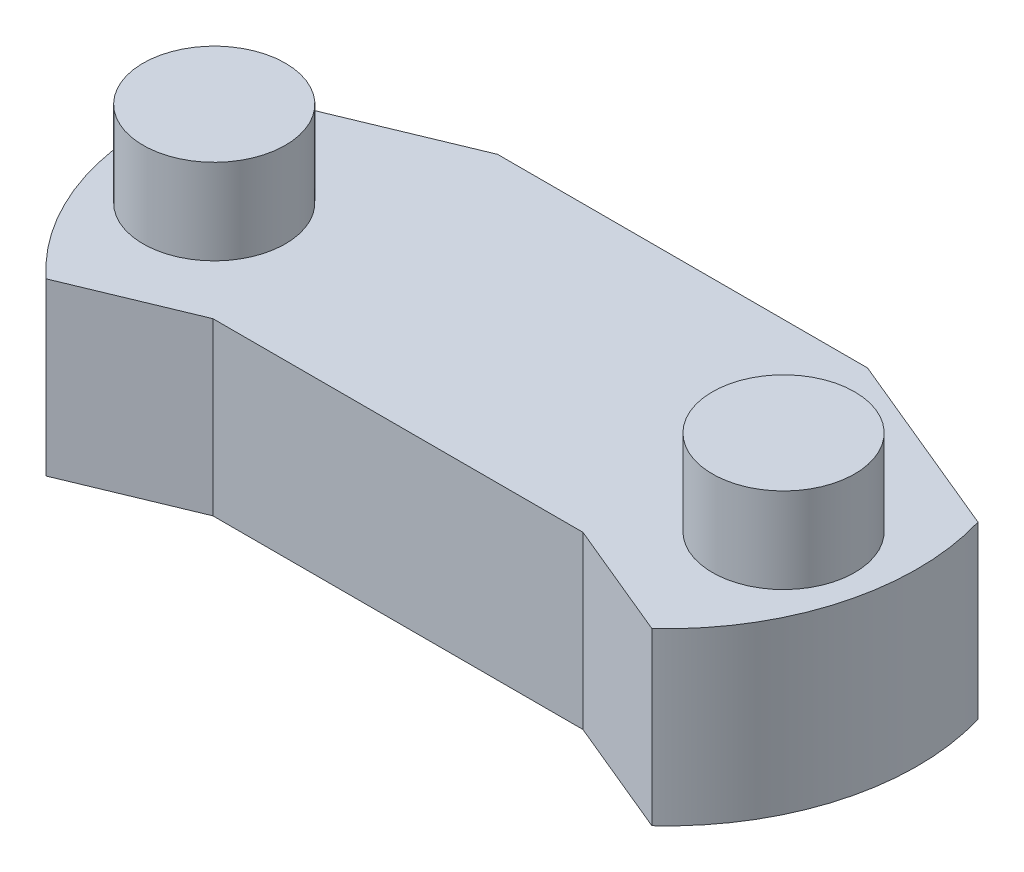
ISO-10303-21;
HEADER;
FILE_DESCRIPTION(('STEP AP214'),'2;1');
FILE_NAME('part.step','',(''),(''),'','','');
FILE_SCHEMA(('AUTOMOTIVE_DESIGN { 1 0 10303 214 1 1 1 1 }'));
ENDSEC;
DATA;
#1=APPLICATION_CONTEXT('core data for automotive mechanical design processes');
#2=APPLICATION_PROTOCOL_DEFINITION('international standard','automotive_design',2000,#1);
#3=PRODUCT_CONTEXT('',#1,'mechanical');
#4=PRODUCT('Part','Part','',(#3));
#5=PRODUCT_RELATED_PRODUCT_CATEGORY('part','',(#4));
#6=PRODUCT_DEFINITION_FORMATION('','',#4);
#7=PRODUCT_DEFINITION_CONTEXT('part definition',#1,'design');
#8=PRODUCT_DEFINITION('design','',#6,#7);
#9=PRODUCT_DEFINITION_SHAPE('','',#8);
#10=(LENGTH_UNIT() NAMED_UNIT(*) SI_UNIT(.MILLI.,.METRE.));
#11=(NAMED_UNIT(*) PLANE_ANGLE_UNIT() SI_UNIT($,.RADIAN.));
#12=(NAMED_UNIT(*) SI_UNIT($,.STERADIAN.) SOLID_ANGLE_UNIT());
#13=UNCERTAINTY_MEASURE_WITH_UNIT(LENGTH_MEASURE(1.E-05),#10,'distance_accuracy_value','');
#14=(GEOMETRIC_REPRESENTATION_CONTEXT(3) GLOBAL_UNCERTAINTY_ASSIGNED_CONTEXT((#13)) GLOBAL_UNIT_ASSIGNED_CONTEXT((#10,
#11,#12)) REPRESENTATION_CONTEXT('',''));
#15=CARTESIAN_POINT('',(0.,0.,0.));
#16=DIRECTION('',(0.,0.,1.));
#17=DIRECTION('',(1.,0.,0.));
#18=AXIS2_PLACEMENT_3D('',#15,#16,#17);
#19=CARTESIAN_POINT('',(1.67686501105315,30.,4.04279490956449));
#20=DIRECTION('',(0.383128915159058,0.,0.923694881640601));
#21=DIRECTION('',(0.923694881640601,0.,-0.383128915159058));
#22=AXIS2_PLACEMENT_3D('',#19,#20,#21);
#23=PLANE('',#22);
#24=DIRECTION('',(-0.923694881640601,0.,0.383128915159058));
#25=VECTOR('',#24,1.);
#26=CARTESIAN_POINT('',(1.67686501105315,30.,4.04279490956449));
#27=LINE('',#26,#25);
#28=CARTESIAN_POINT('',(-21.4869685192061,30.,13.6506584885101));
#29=VERTEX_POINT('',#28);
#30=CARTESIAN_POINT('',(-42.1841053295727,30.,22.2353889343152));
#31=VERTEX_POINT('',#30);
#32=EDGE_CURVE('E126',#29,#31,#27,.T.);
#33=ORIENTED_EDGE('',*,*,#32,.T.);
#34=DIRECTION('',(0.,1.,0.));
#35=VECTOR('',#34,1.);
#36=CARTESIAN_POINT('',(-42.1841053295727,0.,22.2353889343152));
#37=LINE('',#36,#35);
#38=CARTESIAN_POINT('',(-42.1841053295727,0.,22.2353889343152));
#39=VERTEX_POINT('',#38);
#40=EDGE_CURVE('E122',#39,#31,#37,.T.);
#41=ORIENTED_EDGE('',*,*,#40,.F.);
#42=DIRECTION('',(-0.923694881640601,0.,0.383128915159058));
#43=VECTOR('',#42,1.);
#44=CARTESIAN_POINT('',(1.67686501105315,0.,4.04279490956449));
#45=LINE('',#44,#43);
#46=CARTESIAN_POINT('',(-21.4869685192061,0.,13.6506584885101));
#47=VERTEX_POINT('',#46);
#48=EDGE_CURVE('E121',#47,#39,#45,.T.);
#49=ORIENTED_EDGE('',*,*,#48,.F.);
#50=DIRECTION('',(0.,-1.,0.));
#51=VECTOR('',#50,1.);
#52=CARTESIAN_POINT('',(-21.4869685192061,30.,13.6506584885101));
#53=LINE('',#52,#51);
#54=EDGE_CURVE('E111',#29,#47,#53,.T.);
#55=ORIENTED_EDGE('',*,*,#54,.F.);
#56=EDGE_LOOP('',(#33,#41,#49,#55));
#57=FACE_BOUND('',#56,.T.);
#58=ADVANCED_FACE('F43',(#57),#23,.T.);
#59=CARTESIAN_POINT('',(0.,30.,0.));
#60=DIRECTION('',(0.,1.,0.));
#61=DIRECTION('',(0.,0.,1.));
#62=AXIS2_PLACEMENT_3D('',#59,#60,#61);
#63=PLANE('',#62);
#64=CARTESIAN_POINT('',(-38.9869685192061,30.,-4.09071515277821));
#65=DIRECTION('',(0.,1.,0.));
#66=DIRECTION('',(0.,0.,1.));
#67=AXIS2_PLACEMENT_3D('',#64,#65,#66);
#68=CIRCLE('',#67,12.5);
#69=CARTESIAN_POINT('',(-38.9869685192061,30.,-16.5907151527782));
#70=VERTEX_POINT('',#69);
#71=EDGE_CURVE('E138',#70,#70,#68,.T.);
#72=ORIENTED_EDGE('',*,*,#71,.F.);
#73=EDGE_LOOP('',(#72));
#74=FACE_BOUND('',#73,.T.);
#75=CARTESIAN_POINT('',(61.0130314807939,30.,-4.09071515277821));
#76=DIRECTION('',(0.,1.,0.));
#77=DIRECTION('',(0.,0.,1.));
#78=AXIS2_PLACEMENT_3D('',#75,#76,#77);
#79=CIRCLE('',#78,12.5);
#80=CARTESIAN_POINT('',(61.0130314807939,30.,-16.5907151527782));
#81=VERTEX_POINT('',#80);
#82=EDGE_CURVE('E158',#81,#81,#79,.T.);
#83=ORIENTED_EDGE('',*,*,#82,.F.);
#84=EDGE_LOOP('',(#83));
#85=FACE_BOUND('',#84,.T.);
#86=DIRECTION('',(-0.923694881640601,0.,0.383128915159058));
#87=VECTOR('',#86,1.);
#88=CARTESIAN_POINT('',(-16.0178458859937,30.,-38.6178168088877));
#89=LINE('',#88,#87);
#90=CARTESIAN_POINT('',(-21.4869685192061,30.,-36.3493415114899));
#91=VERTEX_POINT('',#90);
#92=CARTESIAN_POINT('',(-54.6363552646833,30.,-22.5996836597272));
#93=VERTEX_POINT('',#92);
#94=EDGE_CURVE('E195',#91,#93,#89,.T.);
#95=ORIENTED_EDGE('',*,*,#94,.T.);
#96=CARTESIAN_POINT('',(-12.5032572490021,30.,-10.1547553443413));
#97=DIRECTION('',(0.,1.,0.));
#98=DIRECTION('',(0.,0.,1.));
#99=AXIS2_PLACEMENT_3D('',#96,#97,#98);
#100=CIRCLE('',#99,43.9326096330971);
#101=EDGE_CURVE('E57',#93,#31,#100,.T.);
#102=ORIENTED_EDGE('',*,*,#101,.T.);
#103=ORIENTED_EDGE('',*,*,#32,.F.);
#104=DIRECTION('',(1.,0.,0.));
#105=VECTOR('',#104,1.);
#106=CARTESIAN_POINT('',(0.,30.,13.6506584885101));
#107=LINE('',#106,#105);
#108=CARTESIAN_POINT('',(43.5130314807939,30.,13.6506584885101));
#109=VERTEX_POINT('',#108);
#110=EDGE_CURVE('E130',#29,#109,#107,.T.);
#111=ORIENTED_EDGE('',*,*,#110,.T.);
#112=DIRECTION('',(0.923694881640601,0.,0.383128915159058));
#113=VECTOR('',#112,1.);
#114=CARTESIAN_POINT('',(1.55629155672509,30.,-3.75210141654448));
#115=LINE('',#114,#113);
#116=CARTESIAN_POINT('',(64.2101682911605,30.,22.2353889343152));
#117=VERTEX_POINT('',#116);
#118=EDGE_CURVE('E179',#109,#117,#115,.T.);
#119=ORIENTED_EDGE('',*,*,#118,.T.);
#120=CARTESIAN_POINT('',(34.5293202105899,30.,-10.1547553443413));
#121=DIRECTION('',(0.,1.,0.));
#122=DIRECTION('',(0.,0.,1.));
#123=AXIS2_PLACEMENT_3D('',#120,#121,#122);
#124=CIRCLE('',#123,43.9326096330971);
#125=CARTESIAN_POINT('',(76.6624182262711,30.,-22.5996836597271));
#126=VERTEX_POINT('',#125);
#127=EDGE_CURVE('E172',#126,#117,#124,.F.);
#128=ORIENTED_EDGE('',*,*,#127,.F.);
#129=DIRECTION('',(0.923694881640601,0.,0.383128915159058));
#130=VECTOR('',#129,1.);
#131=CARTESIAN_POINT('',(19.251002453772,30.,-46.4127131349967));
#132=LINE('',#131,#130);
#133=CARTESIAN_POINT('',(43.5130314807939,30.,-36.3493415114899));
#134=VERTEX_POINT('',#133);
#135=EDGE_CURVE('E169',#134,#126,#132,.T.);
#136=ORIENTED_EDGE('',*,*,#135,.F.);
#137=DIRECTION('',(1.,0.,0.));
#138=VECTOR('',#137,1.);
#139=CARTESIAN_POINT('',(0.,30.,-36.3493415114899));
#140=LINE('',#139,#138);
#141=EDGE_CURVE('E194',#91,#134,#140,.T.);
#142=ORIENTED_EDGE('',*,*,#141,.F.);
#143=EDGE_LOOP('',(#95,#102,#103,#111,#119,#128,#136,#142));
#144=FACE_BOUND('',#143,.T.);
#145=ADVANCED_FACE('F176',(#74,#85,#144),#63,.T.);
#146=CARTESIAN_POINT('',(0.,0.,0.));
#147=DIRECTION('',(0.,1.,0.));
#148=DIRECTION('',(0.,0.,1.));
#149=AXIS2_PLACEMENT_3D('',#146,#147,#148);
#150=PLANE('',#149);
#151=CARTESIAN_POINT('',(-12.5032572490021,0.,-10.1547553443413));
#152=DIRECTION('',(0.,1.,0.));
#153=DIRECTION('',(0.,0.,1.));
#154=AXIS2_PLACEMENT_3D('',#151,#152,#153);
#155=CIRCLE('',#154,43.9326096330971);
#156=CARTESIAN_POINT('',(-54.6363552646833,0.,-22.5996836597272));
#157=VERTEX_POINT('',#156);
#158=EDGE_CURVE('E105',#157,#39,#155,.T.);
#159=ORIENTED_EDGE('',*,*,#158,.F.);
#160=DIRECTION('',(-0.923694881640601,0.,0.383128915159058));
#161=VECTOR('',#160,1.);
#162=CARTESIAN_POINT('',(-16.0178458859937,0.,-38.6178168088877));
#163=LINE('',#162,#161);
#164=CARTESIAN_POINT('',(-21.4869685192061,0.,-36.3493415114899));
#165=VERTEX_POINT('',#164);
#166=EDGE_CURVE('E117',#165,#157,#163,.T.);
#167=ORIENTED_EDGE('',*,*,#166,.F.);
#168=DIRECTION('',(1.,0.,0.));
#169=VECTOR('',#168,1.);
#170=CARTESIAN_POINT('',(0.,0.,-36.3493415114899));
#171=LINE('',#170,#169);
#172=CARTESIAN_POINT('',(43.5130314807939,0.,-36.3493415114899));
#173=VERTEX_POINT('',#172);
#174=EDGE_CURVE('E127',#165,#173,#171,.T.);
#175=ORIENTED_EDGE('',*,*,#174,.T.);
#176=DIRECTION('',(0.923694881640601,0.,0.383128915159058));
#177=VECTOR('',#176,1.);
#178=CARTESIAN_POINT('',(19.251002453772,0.,-46.4127131349967));
#179=LINE('',#178,#177);
#180=CARTESIAN_POINT('',(76.6624182262711,0.,-22.5996836597271));
#181=VERTEX_POINT('',#180);
#182=EDGE_CURVE('E132',#173,#181,#179,.T.);
#183=ORIENTED_EDGE('',*,*,#182,.T.);
#184=CARTESIAN_POINT('',(34.5293202105899,0.,-10.1547553443413));
#185=DIRECTION('',(0.,1.,0.));
#186=DIRECTION('',(0.,0.,1.));
#187=AXIS2_PLACEMENT_3D('',#184,#185,#186);
#188=CIRCLE('',#187,43.9326096330971);
#189=CARTESIAN_POINT('',(64.2101682911605,0.,22.2353889343152));
#190=VERTEX_POINT('',#189);
#191=EDGE_CURVE('E65',#181,#190,#188,.F.);
#192=ORIENTED_EDGE('',*,*,#191,.T.);
#193=DIRECTION('',(0.923694881640601,0.,0.383128915159058));
#194=VECTOR('',#193,1.);
#195=CARTESIAN_POINT('',(1.55629155672509,0.,-3.75210141654448));
#196=LINE('',#195,#194);
#197=CARTESIAN_POINT('',(43.5130314807939,0.,13.6506584885101));
#198=VERTEX_POINT('',#197);
#199=EDGE_CURVE('E153',#198,#190,#196,.T.);
#200=ORIENTED_EDGE('',*,*,#199,.F.);
#201=DIRECTION('',(1.,0.,0.));
#202=VECTOR('',#201,1.);
#203=CARTESIAN_POINT('',(0.,0.,13.6506584885101));
#204=LINE('',#203,#202);
#205=EDGE_CURVE('E148',#47,#198,#204,.T.);
#206=ORIENTED_EDGE('',*,*,#205,.F.);
#207=ORIENTED_EDGE('',*,*,#48,.T.);
#208=EDGE_LOOP('',(#159,#167,#175,#183,#192,#200,#206,#207));
#209=FACE_BOUND('',#208,.T.);
#210=ADVANCED_FACE('F115',(#209),#150,.F.);
#211=CARTESIAN_POINT('',(0.,30.,13.6506584885101));
#212=DIRECTION('',(0.,0.,-1.));
#213=DIRECTION('',(-1.,0.,0.));
#214=AXIS2_PLACEMENT_3D('',#211,#212,#213);
#215=PLANE('',#214);
#216=ORIENTED_EDGE('',*,*,#205,.T.);
#217=DIRECTION('',(0.,-1.,0.));
#218=VECTOR('',#217,1.);
#219=CARTESIAN_POINT('',(43.5130314807939,30.,13.6506584885101));
#220=LINE('',#219,#218);
#221=EDGE_CURVE('E140',#109,#198,#220,.T.);
#222=ORIENTED_EDGE('',*,*,#221,.F.);
#223=ORIENTED_EDGE('',*,*,#110,.F.);
#224=ORIENTED_EDGE('',*,*,#54,.T.);
#225=EDGE_LOOP('',(#216,#222,#223,#224));
#226=FACE_BOUND('',#225,.T.);
#227=ADVANCED_FACE('F146',(#226),#215,.F.);
#228=CARTESIAN_POINT('',(1.55629155672509,30.,-3.75210141654448));
#229=DIRECTION('',(0.383128915159058,0.,-0.923694881640601));
#230=DIRECTION('',(-0.923694881640601,0.,-0.383128915159058));
#231=AXIS2_PLACEMENT_3D('',#228,#229,#230);
#232=PLANE('',#231);
#233=ORIENTED_EDGE('',*,*,#199,.T.);
#234=DIRECTION('',(0.,1.,0.));
#235=VECTOR('',#234,1.);
#236=CARTESIAN_POINT('',(64.2101682911605,0.,22.2353889343152));
#237=LINE('',#236,#235);
#238=EDGE_CURVE('E181',#190,#117,#237,.T.);
#239=ORIENTED_EDGE('',*,*,#238,.T.);
#240=ORIENTED_EDGE('',*,*,#118,.F.);
#241=ORIENTED_EDGE('',*,*,#221,.T.);
#242=EDGE_LOOP('',(#233,#239,#240,#241));
#243=FACE_BOUND('',#242,.T.);
#244=ADVANCED_FACE('F241',(#243),#232,.F.);
#245=CARTESIAN_POINT('',(19.251002453772,30.,-46.4127131349967));
#246=DIRECTION('',(0.383128915159058,0.,-0.923694881640601));
#247=DIRECTION('',(-0.923694881640601,0.,-0.383128915159058));
#248=AXIS2_PLACEMENT_3D('',#245,#246,#247);
#249=PLANE('',#248);
#250=ORIENTED_EDGE('',*,*,#135,.T.);
#251=DIRECTION('',(0.,-1.,0.));
#252=VECTOR('',#251,1.);
#253=CARTESIAN_POINT('',(76.6624182262711,30.,-22.5996836597271));
#254=LINE('',#253,#252);
#255=EDGE_CURVE('E11',#126,#181,#254,.T.);
#256=ORIENTED_EDGE('',*,*,#255,.T.);
#257=ORIENTED_EDGE('',*,*,#182,.F.);
#258=DIRECTION('',(0.,-1.,0.));
#259=VECTOR('',#258,1.);
#260=CARTESIAN_POINT('',(43.5130314807939,30.,-36.3493415114899));
#261=LINE('',#260,#259);
#262=EDGE_CURVE('E137',#134,#173,#261,.T.);
#263=ORIENTED_EDGE('',*,*,#262,.F.);
#264=EDGE_LOOP('',(#250,#256,#257,#263));
#265=FACE_BOUND('',#264,.T.);
#266=ADVANCED_FACE('F167',(#265),#249,.T.);
#267=CARTESIAN_POINT('',(0.,30.,-36.3493415114899));
#268=DIRECTION('',(0.,0.,-1.));
#269=DIRECTION('',(-1.,0.,0.));
#270=AXIS2_PLACEMENT_3D('',#267,#268,#269);
#271=PLANE('',#270);
#272=ORIENTED_EDGE('',*,*,#174,.F.);
#273=DIRECTION('',(0.,-1.,0.));
#274=VECTOR('',#273,1.);
#275=CARTESIAN_POINT('',(-21.4869685192061,30.,-36.3493415114899));
#276=LINE('',#275,#274);
#277=EDGE_CURVE('E125',#91,#165,#276,.T.);
#278=ORIENTED_EDGE('',*,*,#277,.F.);
#279=ORIENTED_EDGE('',*,*,#141,.T.);
#280=ORIENTED_EDGE('',*,*,#262,.T.);
#281=EDGE_LOOP('',(#272,#278,#279,#280));
#282=FACE_BOUND('',#281,.T.);
#283=ADVANCED_FACE('F254',(#282),#271,.T.);
#284=CARTESIAN_POINT('',(-16.0178458859937,30.,-38.6178168088877));
#285=DIRECTION('',(0.383128915159058,0.,0.923694881640601));
#286=DIRECTION('',(0.923694881640601,0.,-0.383128915159058));
#287=AXIS2_PLACEMENT_3D('',#284,#285,#286);
#288=PLANE('',#287);
#289=ORIENTED_EDGE('',*,*,#166,.T.);
#290=DIRECTION('',(0.,-1.,0.));
#291=VECTOR('',#290,1.);
#292=CARTESIAN_POINT('',(-54.6363552646833,30.,-22.5996836597272));
#293=LINE('',#292,#291);
#294=EDGE_CURVE('E50',#157,#93,#293,.F.);
#295=ORIENTED_EDGE('',*,*,#294,.T.);
#296=ORIENTED_EDGE('',*,*,#94,.F.);
#297=ORIENTED_EDGE('',*,*,#277,.T.);
#298=EDGE_LOOP('',(#289,#295,#296,#297));
#299=FACE_BOUND('',#298,.T.);
#300=ADVANCED_FACE('F124',(#299),#288,.F.);
#301=CARTESIAN_POINT('',(-38.9869685192061,45.,-4.09071515277821));
#302=DIRECTION('',(0.,-1.,0.));
#303=DIRECTION('',(0.,0.,-1.));
#304=AXIS2_PLACEMENT_3D('',#301,#302,#303);
#305=CYLINDRICAL_SURFACE('',#304,12.5);
#306=CARTESIAN_POINT('',(-38.9869685192061,45.,-4.09071515277821));
#307=DIRECTION('',(0.,-1.,0.));
#308=DIRECTION('',(0.,0.,-1.));
#309=AXIS2_PLACEMENT_3D('',#306,#307,#308);
#310=CIRCLE('',#309,12.5);
#311=CARTESIAN_POINT('',(-38.9869685192061,45.,-16.5907151527782));
#312=VERTEX_POINT('',#311);
#313=EDGE_CURVE('E155',#312,#312,#310,.T.);
#314=CARTESIAN_POINT('',(-38.9869685192061,30.,-16.5907151527782));
#315=CARTESIAN_POINT('',(-38.9869685192061,30.15625,-16.5907151527782));
#316=CARTESIAN_POINT('',(-38.9869685192061,30.3125,-16.5907151527782));
#317=CARTESIAN_POINT('',(-38.9869685192061,30.625,-16.5907151527782));
#318=CARTESIAN_POINT('',(-38.9869685192061,30.78125,-16.5907151527782));
#319=CARTESIAN_POINT('',(-38.9869685192061,31.09375,-16.5907151527782));
#320=CARTESIAN_POINT('',(-38.9869685192061,31.25,-16.5907151527782));
#321=CARTESIAN_POINT('',(-38.9869685192061,31.5625,-16.5907151527782));
#322=CARTESIAN_POINT('',(-38.9869685192061,31.71875,-16.5907151527782));
#323=CARTESIAN_POINT('',(-38.9869685192061,32.03125,-16.5907151527782));
#324=CARTESIAN_POINT('',(-38.9869685192061,32.1875,-16.5907151527782));
#325=CARTESIAN_POINT('',(-38.9869685192061,32.5,-16.5907151527782));
#326=CARTESIAN_POINT('',(-38.9869685192061,32.65625,-16.5907151527782));
#327=CARTESIAN_POINT('',(-38.9869685192061,32.96875,-16.5907151527782));
#328=CARTESIAN_POINT('',(-38.9869685192061,33.125,-16.5907151527782));
#329=CARTESIAN_POINT('',(-38.9869685192061,33.4375,-16.5907151527782));
#330=CARTESIAN_POINT('',(-38.9869685192061,33.59375,-16.5907151527782));
#331=CARTESIAN_POINT('',(-38.9869685192061,33.90625,-16.5907151527782));
#332=CARTESIAN_POINT('',(-38.9869685192061,34.0625,-16.5907151527782));
#333=CARTESIAN_POINT('',(-38.9869685192061,34.375,-16.5907151527782));
#334=CARTESIAN_POINT('',(-38.9869685192061,34.53125,-16.5907151527782));
#335=CARTESIAN_POINT('',(-38.9869685192061,34.84375,-16.5907151527782));
#336=CARTESIAN_POINT('',(-38.9869685192061,35.,-16.5907151527782));
#337=CARTESIAN_POINT('',(-38.9869685192061,35.3125,-16.5907151527782));
#338=CARTESIAN_POINT('',(-38.9869685192061,35.46875,-16.5907151527782));
#339=CARTESIAN_POINT('',(-38.9869685192061,35.78125,-16.5907151527782));
#340=CARTESIAN_POINT('',(-38.9869685192061,35.9375,-16.5907151527782));
#341=CARTESIAN_POINT('',(-38.9869685192061,36.25,-16.5907151527782));
#342=CARTESIAN_POINT('',(-38.9869685192061,36.40625,-16.5907151527782));
#343=CARTESIAN_POINT('',(-38.9869685192061,36.71875,-16.5907151527782));
#344=CARTESIAN_POINT('',(-38.9869685192061,36.875,-16.5907151527782));
#345=CARTESIAN_POINT('',(-38.9869685192061,37.1875,-16.5907151527782));
#346=CARTESIAN_POINT('',(-38.9869685192061,37.34375,-16.5907151527782));
#347=CARTESIAN_POINT('',(-38.9869685192061,37.65625,-16.5907151527782));
#348=CARTESIAN_POINT('',(-38.9869685192061,37.8125,-16.5907151527782));
#349=CARTESIAN_POINT('',(-38.9869685192061,38.125,-16.5907151527782));
#350=CARTESIAN_POINT('',(-38.9869685192061,38.28125,-16.5907151527782));
#351=CARTESIAN_POINT('',(-38.9869685192061,38.59375,-16.5907151527782));
#352=CARTESIAN_POINT('',(-38.9869685192061,38.75,-16.5907151527782));
#353=CARTESIAN_POINT('',(-38.9869685192061,39.0625,-16.5907151527782));
#354=CARTESIAN_POINT('',(-38.9869685192061,39.21875,-16.5907151527782));
#355=CARTESIAN_POINT('',(-38.9869685192061,39.53125,-16.5907151527782));
#356=CARTESIAN_POINT('',(-38.9869685192061,39.6875,-16.5907151527782));
#357=CARTESIAN_POINT('',(-38.9869685192061,40.,-16.5907151527782));
#358=CARTESIAN_POINT('',(-38.9869685192061,40.15625,-16.5907151527782));
#359=CARTESIAN_POINT('',(-38.9869685192061,40.46875,-16.5907151527782));
#360=CARTESIAN_POINT('',(-38.9869685192061,40.625,-16.5907151527782));
#361=CARTESIAN_POINT('',(-38.9869685192061,40.9375,-16.5907151527782));
#362=CARTESIAN_POINT('',(-38.9869685192061,41.09375,-16.5907151527782));
#363=CARTESIAN_POINT('',(-38.9869685192061,41.40625,-16.5907151527782));
#364=CARTESIAN_POINT('',(-38.9869685192061,41.5625,-16.5907151527782));
#365=CARTESIAN_POINT('',(-38.9869685192061,41.875,-16.5907151527782));
#366=CARTESIAN_POINT('',(-38.9869685192061,42.03125,-16.5907151527782));
#367=CARTESIAN_POINT('',(-38.9869685192061,42.34375,-16.5907151527782));
#368=CARTESIAN_POINT('',(-38.9869685192061,42.5,-16.5907151527782));
#369=CARTESIAN_POINT('',(-38.9869685192061,42.8125,-16.5907151527782));
#370=CARTESIAN_POINT('',(-38.9869685192061,42.96875,-16.5907151527782));
#371=CARTESIAN_POINT('',(-38.9869685192061,43.28125,-16.5907151527782));
#372=CARTESIAN_POINT('',(-38.9869685192061,43.4375,-16.5907151527782));
#373=CARTESIAN_POINT('',(-38.9869685192061,43.75,-16.5907151527782));
#374=CARTESIAN_POINT('',(-38.9869685192061,43.90625,-16.5907151527782));
#375=CARTESIAN_POINT('',(-38.9869685192061,44.21875,-16.5907151527782));
#376=CARTESIAN_POINT('',(-38.9869685192061,44.375,-16.5907151527782));
#377=CARTESIAN_POINT('',(-38.9869685192061,44.6875,-16.5907151527782));
#378=CARTESIAN_POINT('',(-38.9869685192061,44.84375,-16.5907151527782));
#379=CARTESIAN_POINT('',(-38.9869685192061,45.,-16.5907151527782));
#380=B_SPLINE_CURVE_WITH_KNOTS('',3,(#314,#315,#316,#317,#318,#319,#320,#321,#322,#323,#324,
#325,#326,#327,#328,#329,#330,#331,#332,#333,#334,#335,#336,#337,#338,#339,#340,#341,#342,#343,
#344,#345,#346,#347,#348,#349,#350,#351,#352,#353,#354,#355,#356,#357,#358,#359,#360,#361,#362,
#363,#364,#365,#366,#367,#368,#369,#370,#371,#372,#373,#374,#375,#376,#377,#378,#379),
.UNSPECIFIED.,.F.,.F.,(4,2,2,2,2,2,2,2,2,2,2,2,2,2,2,2,2,2,2,2,2,2,2,2,2,2,2,2,2,2,2,2,4),(0.,
0.468749999999997,0.937500000000001,1.40625,1.875,2.34375,2.8125,3.28125,3.75,4.21875,4.6875,
5.15625,5.625,6.09375,6.5625,7.03125,7.5,7.96875,8.4375,8.90625,9.375,9.84375,10.3125,10.78125,
11.25,11.71875,12.1875,12.65625,13.125,13.59375,14.0625,14.53125,15.),.UNSPECIFIED.);
#381=EDGE_CURVE('BSEAM199',#70,#312,#380,.T.);
#382=ORIENTED_EDGE('',*,*,#71,.T.);
#383=ORIENTED_EDGE('',*,*,#313,.T.);
#384=ORIENTED_EDGE('',*,*,#381,.T.);
#385=ORIENTED_EDGE('',*,*,#381,.F.);
#386=EDGE_LOOP('',(#382,#384,#383,#385));
#387=FACE_BOUND('',#386,.T.);
#388=ADVANCED_FACE('F199',(#387),#305,.T.);
#389=CARTESIAN_POINT('',(-38.9869685192061,45.,-4.09071515277821));
#390=DIRECTION('',(0.,-1.,0.));
#391=DIRECTION('',(0.,0.,-1.));
#392=AXIS2_PLACEMENT_3D('',#389,#390,#391);
#393=PLANE('',#392);
#394=ORIENTED_EDGE('',*,*,#313,.F.);
#395=EDGE_LOOP('',(#394));
#396=FACE_BOUND('',#395,.T.);
#397=ADVANCED_FACE('F211',(#396),#393,.F.);
#398=CARTESIAN_POINT('',(61.0130314807939,45.,-4.09071515277821));
#399=DIRECTION('',(0.,-1.,0.));
#400=DIRECTION('',(0.,0.,-1.));
#401=AXIS2_PLACEMENT_3D('',#398,#399,#400);
#402=CYLINDRICAL_SURFACE('',#401,12.5);
#403=CARTESIAN_POINT('',(61.0130314807939,45.,-4.09071515277821));
#404=DIRECTION('',(0.,-1.,0.));
#405=DIRECTION('',(0.,0.,-1.));
#406=AXIS2_PLACEMENT_3D('',#403,#404,#405);
#407=CIRCLE('',#406,12.5);
#408=CARTESIAN_POINT('',(61.0130314807939,45.,-16.5907151527782));
#409=VERTEX_POINT('',#408);
#410=EDGE_CURVE('E186',#409,#409,#407,.T.);
#411=CARTESIAN_POINT('',(61.0130314807939,30.,-16.5907151527782));
#412=CARTESIAN_POINT('',(61.0130314807939,30.15625,-16.5907151527782));
#413=CARTESIAN_POINT('',(61.0130314807939,30.3125,-16.5907151527782));
#414=CARTESIAN_POINT('',(61.0130314807939,30.625,-16.5907151527782));
#415=CARTESIAN_POINT('',(61.0130314807939,30.78125,-16.5907151527782));
#416=CARTESIAN_POINT('',(61.0130314807939,31.09375,-16.5907151527782));
#417=CARTESIAN_POINT('',(61.0130314807939,31.25,-16.5907151527782));
#418=CARTESIAN_POINT('',(61.0130314807939,31.5625,-16.5907151527782));
#419=CARTESIAN_POINT('',(61.0130314807939,31.71875,-16.5907151527782));
#420=CARTESIAN_POINT('',(61.0130314807939,32.03125,-16.5907151527782));
#421=CARTESIAN_POINT('',(61.0130314807939,32.1875,-16.5907151527782));
#422=CARTESIAN_POINT('',(61.0130314807939,32.5,-16.5907151527782));
#423=CARTESIAN_POINT('',(61.0130314807939,32.65625,-16.5907151527782));
#424=CARTESIAN_POINT('',(61.0130314807939,32.96875,-16.5907151527782));
#425=CARTESIAN_POINT('',(61.0130314807939,33.125,-16.5907151527782));
#426=CARTESIAN_POINT('',(61.0130314807939,33.4375,-16.5907151527782));
#427=CARTESIAN_POINT('',(61.0130314807939,33.59375,-16.5907151527782));
#428=CARTESIAN_POINT('',(61.0130314807939,33.90625,-16.5907151527782));
#429=CARTESIAN_POINT('',(61.0130314807939,34.0625,-16.5907151527782));
#430=CARTESIAN_POINT('',(61.0130314807939,34.375,-16.5907151527782));
#431=CARTESIAN_POINT('',(61.0130314807939,34.53125,-16.5907151527782));
#432=CARTESIAN_POINT('',(61.0130314807939,34.84375,-16.5907151527782));
#433=CARTESIAN_POINT('',(61.0130314807939,35.,-16.5907151527782));
#434=CARTESIAN_POINT('',(61.0130314807939,35.3125,-16.5907151527782));
#435=CARTESIAN_POINT('',(61.0130314807939,35.46875,-16.5907151527782));
#436=CARTESIAN_POINT('',(61.0130314807939,35.78125,-16.5907151527782));
#437=CARTESIAN_POINT('',(61.0130314807939,35.9375,-16.5907151527782));
#438=CARTESIAN_POINT('',(61.0130314807939,36.25,-16.5907151527782));
#439=CARTESIAN_POINT('',(61.0130314807939,36.40625,-16.5907151527782));
#440=CARTESIAN_POINT('',(61.0130314807939,36.71875,-16.5907151527782));
#441=CARTESIAN_POINT('',(61.0130314807939,36.875,-16.5907151527782));
#442=CARTESIAN_POINT('',(61.0130314807939,37.1875,-16.5907151527782));
#443=CARTESIAN_POINT('',(61.0130314807939,37.34375,-16.5907151527782));
#444=CARTESIAN_POINT('',(61.0130314807939,37.65625,-16.5907151527782));
#445=CARTESIAN_POINT('',(61.0130314807939,37.8125,-16.5907151527782));
#446=CARTESIAN_POINT('',(61.0130314807939,38.125,-16.5907151527782));
#447=CARTESIAN_POINT('',(61.0130314807939,38.28125,-16.5907151527782));
#448=CARTESIAN_POINT('',(61.0130314807939,38.59375,-16.5907151527782));
#449=CARTESIAN_POINT('',(61.0130314807939,38.75,-16.5907151527782));
#450=CARTESIAN_POINT('',(61.0130314807939,39.0625,-16.5907151527782));
#451=CARTESIAN_POINT('',(61.0130314807939,39.21875,-16.5907151527782));
#452=CARTESIAN_POINT('',(61.0130314807939,39.53125,-16.5907151527782));
#453=CARTESIAN_POINT('',(61.0130314807939,39.6875,-16.5907151527782));
#454=CARTESIAN_POINT('',(61.0130314807939,40.,-16.5907151527782));
#455=CARTESIAN_POINT('',(61.0130314807939,40.15625,-16.5907151527782));
#456=CARTESIAN_POINT('',(61.0130314807939,40.46875,-16.5907151527782));
#457=CARTESIAN_POINT('',(61.0130314807939,40.625,-16.5907151527782));
#458=CARTESIAN_POINT('',(61.0130314807939,40.9375,-16.5907151527782));
#459=CARTESIAN_POINT('',(61.0130314807939,41.09375,-16.5907151527782));
#460=CARTESIAN_POINT('',(61.0130314807939,41.40625,-16.5907151527782));
#461=CARTESIAN_POINT('',(61.0130314807939,41.5625,-16.5907151527782));
#462=CARTESIAN_POINT('',(61.0130314807939,41.875,-16.5907151527782));
#463=CARTESIAN_POINT('',(61.0130314807939,42.03125,-16.5907151527782));
#464=CARTESIAN_POINT('',(61.0130314807939,42.34375,-16.5907151527782));
#465=CARTESIAN_POINT('',(61.0130314807939,42.5,-16.5907151527782));
#466=CARTESIAN_POINT('',(61.0130314807939,42.8125,-16.5907151527782));
#467=CARTESIAN_POINT('',(61.0130314807939,42.96875,-16.5907151527782));
#468=CARTESIAN_POINT('',(61.0130314807939,43.28125,-16.5907151527782));
#469=CARTESIAN_POINT('',(61.0130314807939,43.4375,-16.5907151527782));
#470=CARTESIAN_POINT('',(61.0130314807939,43.75,-16.5907151527782));
#471=CARTESIAN_POINT('',(61.0130314807939,43.90625,-16.5907151527782));
#472=CARTESIAN_POINT('',(61.0130314807939,44.21875,-16.5907151527782));
#473=CARTESIAN_POINT('',(61.0130314807939,44.375,-16.5907151527782));
#474=CARTESIAN_POINT('',(61.0130314807939,44.6875,-16.5907151527782));
#475=CARTESIAN_POINT('',(61.0130314807939,44.84375,-16.5907151527782));
#476=CARTESIAN_POINT('',(61.0130314807939,45.,-16.5907151527782));
#477=B_SPLINE_CURVE_WITH_KNOTS('',3,(#411,#412,#413,#414,#415,#416,#417,#418,#419,#420,#421,
#422,#423,#424,#425,#426,#427,#428,#429,#430,#431,#432,#433,#434,#435,#436,#437,#438,#439,#440,
#441,#442,#443,#444,#445,#446,#447,#448,#449,#450,#451,#452,#453,#454,#455,#456,#457,#458,#459,
#460,#461,#462,#463,#464,#465,#466,#467,#468,#469,#470,#471,#472,#473,#474,#475,#476),
.UNSPECIFIED.,.F.,.F.,(4,2,2,2,2,2,2,2,2,2,2,2,2,2,2,2,2,2,2,2,2,2,2,2,2,2,2,2,2,2,2,2,4),(0.,
0.468749999999997,0.937500000000001,1.40625,1.875,2.34375,2.8125,3.28125,3.75,4.21875,4.6875,
5.15625,5.625,6.09375,6.5625,7.03125,7.5,7.96875,8.4375,8.90625,9.375,9.84375,10.3125,10.78125,
11.25,11.71875,12.1875,12.65625,13.125,13.59375,14.0625,14.53125,15.),.UNSPECIFIED.);
#478=EDGE_CURVE('BSEAM207',#81,#409,#477,.T.);
#479=ORIENTED_EDGE('',*,*,#82,.T.);
#480=ORIENTED_EDGE('',*,*,#410,.T.);
#481=ORIENTED_EDGE('',*,*,#478,.T.);
#482=ORIENTED_EDGE('',*,*,#478,.F.);
#483=EDGE_LOOP('',(#479,#481,#480,#482));
#484=FACE_BOUND('',#483,.T.);
#485=ADVANCED_FACE('F207',(#484),#402,.T.);
#486=CARTESIAN_POINT('',(61.0130314807939,45.,-4.09071515277821));
#487=DIRECTION('',(0.,-1.,0.));
#488=DIRECTION('',(0.,0.,-1.));
#489=AXIS2_PLACEMENT_3D('',#486,#487,#488);
#490=PLANE('',#489);
#491=ORIENTED_EDGE('',*,*,#410,.F.);
#492=EDGE_LOOP('',(#491));
#493=FACE_BOUND('',#492,.T.);
#494=ADVANCED_FACE('F210',(#493),#490,.F.);
#495=CARTESIAN_POINT('',(34.5293202105899,0.,-10.1547553443413));
#496=DIRECTION('',(0.,1.,0.));
#497=DIRECTION('',(0.,0.,1.));
#498=AXIS2_PLACEMENT_3D('',#495,#496,#497);
#499=CYLINDRICAL_SURFACE('',#498,43.9326096330971);
#500=ORIENTED_EDGE('',*,*,#127,.T.);
#501=ORIENTED_EDGE('',*,*,#238,.F.);
#502=ORIENTED_EDGE('',*,*,#191,.F.);
#503=ORIENTED_EDGE('',*,*,#255,.F.);
#504=EDGE_LOOP('',(#500,#501,#502,#503));
#505=FACE_BOUND('',#504,.T.);
#506=ADVANCED_FACE('F171',(#505),#499,.T.);
#507=CARTESIAN_POINT('',(-12.5032572490021,0.,-10.1547553443413));
#508=DIRECTION('',(0.,1.,0.));
#509=DIRECTION('',(0.,0.,1.));
#510=AXIS2_PLACEMENT_3D('',#507,#508,#509);
#511=CYLINDRICAL_SURFACE('',#510,43.9326096330971);
#512=ORIENTED_EDGE('',*,*,#101,.F.);
#513=ORIENTED_EDGE('',*,*,#294,.F.);
#514=ORIENTED_EDGE('',*,*,#158,.T.);
#515=ORIENTED_EDGE('',*,*,#40,.T.);
#516=EDGE_LOOP('',(#512,#513,#514,#515));
#517=FACE_BOUND('',#516,.T.);
#518=ADVANCED_FACE('F104',(#517),#511,.T.);
#519=CLOSED_SHELL('',(#58,#145,#210,#227,#244,#266,#283,#300,#388,#397,#485,#494,#506,#518));
#520=MANIFOLD_SOLID_BREP('B2',#519);
#521=ADVANCED_BREP_SHAPE_REPRESENTATION('',(#18,#520),#14);
#522=SHAPE_DEFINITION_REPRESENTATION(#9,#521);
ENDSEC;
END-ISO-10303-21;
